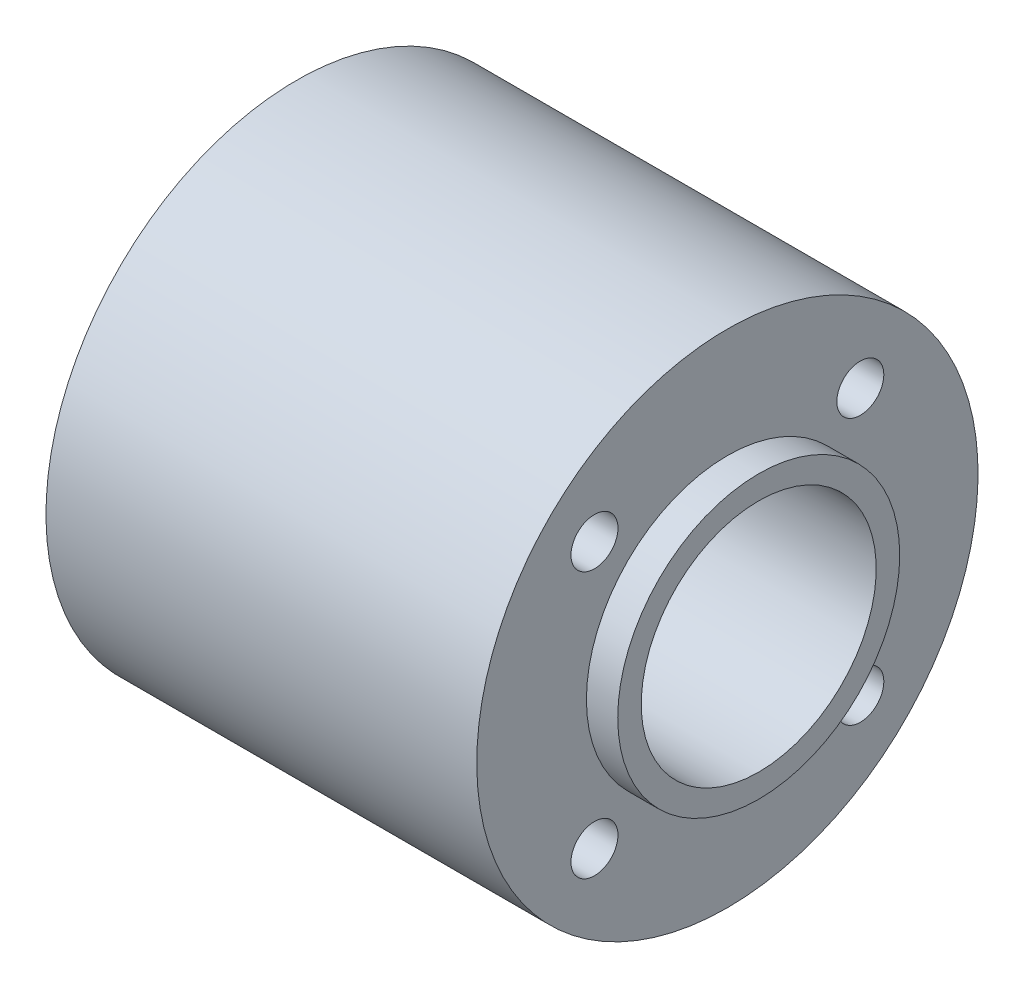
ISO-10303-21;
HEADER;
FILE_DESCRIPTION(('STEP AP214'),'2;1');
FILE_NAME('part.step','',(''),(''),'','','');
FILE_SCHEMA(('AUTOMOTIVE_DESIGN { 1 0 10303 214 1 1 1 1 }'));
ENDSEC;
DATA;
#1=APPLICATION_CONTEXT('core data for automotive mechanical design processes');
#2=APPLICATION_PROTOCOL_DEFINITION('international standard','automotive_design',2000,#1);
#3=PRODUCT_CONTEXT('',#1,'mechanical');
#4=PRODUCT('Part','Part','',(#3));
#5=PRODUCT_RELATED_PRODUCT_CATEGORY('part','',(#4));
#6=PRODUCT_DEFINITION_FORMATION('','',#4);
#7=PRODUCT_DEFINITION_CONTEXT('part definition',#1,'design');
#8=PRODUCT_DEFINITION('design','',#6,#7);
#9=PRODUCT_DEFINITION_SHAPE('','',#8);
#10=(LENGTH_UNIT() NAMED_UNIT(*) SI_UNIT(.MILLI.,.METRE.));
#11=(NAMED_UNIT(*) PLANE_ANGLE_UNIT() SI_UNIT($,.RADIAN.));
#12=(NAMED_UNIT(*) SI_UNIT($,.STERADIAN.) SOLID_ANGLE_UNIT());
#13=UNCERTAINTY_MEASURE_WITH_UNIT(LENGTH_MEASURE(1.E-05),#10,'distance_accuracy_value','');
#14=(GEOMETRIC_REPRESENTATION_CONTEXT(3) GLOBAL_UNCERTAINTY_ASSIGNED_CONTEXT((#13)) GLOBAL_UNIT_ASSIGNED_CONTEXT((#10,
#11,#12)) REPRESENTATION_CONTEXT('',''));
#15=CARTESIAN_POINT('',(0.,0.,0.));
#16=DIRECTION('',(0.,0.,1.));
#17=DIRECTION('',(1.,0.,0.));
#18=AXIS2_PLACEMENT_3D('',#15,#16,#17);
#19=CARTESIAN_POINT('',(15.75,0.,0.));
#20=DIRECTION('',(-1.,0.,0.));
#21=DIRECTION('',(0.,-1.,0.));
#22=AXIS2_PLACEMENT_3D('',#19,#20,#21);
#23=PLANE('',#22);
#24=CARTESIAN_POINT('',(15.75,0.,0.));
#25=DIRECTION('',(-1.,0.,0.));
#26=DIRECTION('',(0.,-1.,0.));
#27=AXIS2_PLACEMENT_3D('',#24,#25,#26);
#28=CIRCLE('',#27,7.5);
#29=CARTESIAN_POINT('',(15.75,-7.5,0.));
#30=VERTEX_POINT('',#29);
#31=EDGE_CURVE('E72',#30,#30,#28,.T.);
#32=ORIENTED_EDGE('',*,*,#31,.T.);
#33=EDGE_LOOP('',(#32));
#34=FACE_BOUND('',#33,.T.);
#35=CARTESIAN_POINT('',(15.75,0.,0.));
#36=DIRECTION('',(-1.,0.,0.));
#37=DIRECTION('',(0.,-1.,0.));
#38=AXIS2_PLACEMENT_3D('',#35,#36,#37);
#39=CIRCLE('',#38,9.);
#40=CARTESIAN_POINT('',(15.75,-9.,0.));
#41=VERTEX_POINT('',#40);
#42=EDGE_CURVE('E10',#41,#41,#39,.T.);
#43=ORIENTED_EDGE('',*,*,#42,.F.);
#44=EDGE_LOOP('',(#43));
#45=FACE_BOUND('',#44,.T.);
#46=ADVANCED_FACE('F30',(#34,#45),#23,.F.);
#47=CARTESIAN_POINT('',(-15.75,0.,0.));
#48=DIRECTION('',(-1.,0.,0.));
#49=DIRECTION('',(0.,-1.,0.));
#50=AXIS2_PLACEMENT_3D('',#47,#48,#49);
#51=CYLINDRICAL_SURFACE('',#50,9.);
#52=CARTESIAN_POINT('',(13.75,0.,0.));
#53=DIRECTION('',(-1.,0.,0.));
#54=DIRECTION('',(0.,-1.,0.));
#55=AXIS2_PLACEMENT_3D('',#52,#53,#54);
#56=CIRCLE('',#55,9.);
#57=CARTESIAN_POINT('',(13.75,-9.,0.));
#58=VERTEX_POINT('',#57);
#59=EDGE_CURVE('E37',#58,#58,#56,.T.);
#60=ORIENTED_EDGE('',*,*,#59,.F.);
#61=EDGE_LOOP('',(#60));
#62=FACE_BOUND('',#61,.T.);
#63=ORIENTED_EDGE('',*,*,#42,.T.);
#64=EDGE_LOOP('',(#63));
#65=FACE_BOUND('',#64,.T.);
#66=ADVANCED_FACE('F91',(#62,#65),#51,.T.);
#67=CARTESIAN_POINT('',(13.75,9.,0.));
#68=DIRECTION('',(-1.,0.,0.));
#69=DIRECTION('',(0.,-1.,0.));
#70=AXIS2_PLACEMENT_3D('',#67,#68,#69);
#71=PLANE('',#70);
#72=CARTESIAN_POINT('',(13.75,-8.48528137423853,8.48528137423853));
#73=DIRECTION('',(-1.,0.,0.));
#74=DIRECTION('',(0.,-1.,0.));
#75=AXIS2_PLACEMENT_3D('',#72,#73,#74);
#76=CIRCLE('',#75,1.50000000000014);
#77=CARTESIAN_POINT('',(13.75,-9.98528137423866,8.48528137423853));
#78=VERTEX_POINT('',#77);
#79=EDGE_CURVE('E66',#78,#78,#76,.T.);
#80=ORIENTED_EDGE('',*,*,#79,.T.);
#81=EDGE_LOOP('',(#80));
#82=FACE_BOUND('',#81,.T.);
#83=CARTESIAN_POINT('',(13.75,-8.48528137423853,-8.48528137423861));
#84=DIRECTION('',(-1.,0.,0.));
#85=DIRECTION('',(0.,-1.,0.));
#86=AXIS2_PLACEMENT_3D('',#83,#84,#85);
#87=CIRCLE('',#86,1.50000000000018);
#88=CARTESIAN_POINT('',(13.75,-9.98528137423871,-8.48528137423861));
#89=VERTEX_POINT('',#88);
#90=EDGE_CURVE('E55',#89,#89,#87,.T.);
#91=ORIENTED_EDGE('',*,*,#90,.T.);
#92=EDGE_LOOP('',(#91));
#93=FACE_BOUND('',#92,.T.);
#94=CARTESIAN_POINT('',(13.75,8.48528137423857,-8.48528137423873));
#95=DIRECTION('',(-1.,0.,0.));
#96=DIRECTION('',(0.,-1.,0.));
#97=AXIS2_PLACEMENT_3D('',#94,#95,#96);
#98=CIRCLE('',#97,1.50000000000005);
#99=CARTESIAN_POINT('',(13.75,6.98528137423852,-8.48528137423873));
#100=VERTEX_POINT('',#99);
#101=EDGE_CURVE('E52',#100,#100,#98,.T.);
#102=ORIENTED_EDGE('',*,*,#101,.T.);
#103=EDGE_LOOP('',(#102));
#104=FACE_BOUND('',#103,.T.);
#105=CARTESIAN_POINT('',(13.75,8.48528137423861,8.48528137423853));
#106=DIRECTION('',(-1.,0.,0.));
#107=DIRECTION('',(0.,-1.,0.));
#108=AXIS2_PLACEMENT_3D('',#105,#106,#107);
#109=CIRCLE('',#108,1.5);
#110=CARTESIAN_POINT('',(13.75,6.98528137423861,8.48528137423853));
#111=VERTEX_POINT('',#110);
#112=EDGE_CURVE('E49',#111,#111,#109,.T.);
#113=ORIENTED_EDGE('',*,*,#112,.T.);
#114=EDGE_LOOP('',(#113));
#115=FACE_BOUND('',#114,.T.);
#116=CARTESIAN_POINT('',(13.75,0.,0.));
#117=DIRECTION('',(-1.,0.,0.));
#118=DIRECTION('',(0.,-1.,0.));
#119=AXIS2_PLACEMENT_3D('',#116,#117,#118);
#120=CIRCLE('',#119,16.);
#121=CARTESIAN_POINT('',(13.75,-16.,0.));
#122=VERTEX_POINT('',#121);
#123=EDGE_CURVE('E42',#122,#122,#120,.T.);
#124=ORIENTED_EDGE('',*,*,#123,.F.);
#125=EDGE_LOOP('',(#124));
#126=FACE_BOUND('',#125,.T.);
#127=ORIENTED_EDGE('',*,*,#59,.T.);
#128=EDGE_LOOP('',(#127));
#129=FACE_BOUND('',#128,.T.);
#130=ADVANCED_FACE('F88',(#82,#93,#104,#115,#126,#129),#71,.F.);
#131=CARTESIAN_POINT('',(-15.75,0.,0.));
#132=DIRECTION('',(-1.,0.,0.));
#133=DIRECTION('',(0.,-1.,0.));
#134=AXIS2_PLACEMENT_3D('',#131,#132,#133);
#135=CYLINDRICAL_SURFACE('',#134,16.);
#136=CARTESIAN_POINT('',(-13.75,0.,0.));
#137=DIRECTION('',(-1.,0.,0.));
#138=DIRECTION('',(0.,-1.,0.));
#139=AXIS2_PLACEMENT_3D('',#136,#137,#138);
#140=CIRCLE('',#139,16.);
#141=CARTESIAN_POINT('',(-13.75,-16.,0.));
#142=VERTEX_POINT('',#141);
#143=EDGE_CURVE('E81',#142,#142,#140,.T.);
#144=ORIENTED_EDGE('',*,*,#143,.F.);
#145=EDGE_LOOP('',(#144));
#146=FACE_BOUND('',#145,.T.);
#147=ORIENTED_EDGE('',*,*,#123,.T.);
#148=EDGE_LOOP('',(#147));
#149=FACE_BOUND('',#148,.T.);
#150=ADVANCED_FACE('F86',(#146,#149),#135,.T.);
#151=CARTESIAN_POINT('',(-13.75,9.,0.));
#152=DIRECTION('',(1.,0.,0.));
#153=DIRECTION('',(0.,1.,0.));
#154=AXIS2_PLACEMENT_3D('',#151,#152,#153);
#155=PLANE('',#154);
#156=CARTESIAN_POINT('',(-13.75,-8.48528137423853,8.48528137423853));
#157=DIRECTION('',(1.,0.,0.));
#158=DIRECTION('',(0.,1.,0.));
#159=AXIS2_PLACEMENT_3D('',#156,#157,#158);
#160=CIRCLE('',#159,1.50000000000014);
#161=CARTESIAN_POINT('',(-13.75,-6.98528137423839,8.48528137423853));
#162=VERTEX_POINT('',#161);
#163=EDGE_CURVE('E33',#162,#162,#160,.T.);
#164=ORIENTED_EDGE('',*,*,#163,.T.);
#165=EDGE_LOOP('',(#164));
#166=FACE_BOUND('',#165,.T.);
#167=CARTESIAN_POINT('',(-13.75,-8.48528137423853,-8.48528137423861));
#168=DIRECTION('',(1.,0.,0.));
#169=DIRECTION('',(0.,1.,0.));
#170=AXIS2_PLACEMENT_3D('',#167,#168,#169);
#171=CIRCLE('',#170,1.50000000000018);
#172=CARTESIAN_POINT('',(-13.75,-6.98528137423835,-8.48528137423861));
#173=VERTEX_POINT('',#172);
#174=EDGE_CURVE('E53',#173,#173,#171,.T.);
#175=ORIENTED_EDGE('',*,*,#174,.T.);
#176=EDGE_LOOP('',(#175));
#177=FACE_BOUND('',#176,.T.);
#178=CARTESIAN_POINT('',(-13.75,8.48528137423857,-8.48528137423873));
#179=DIRECTION('',(1.,0.,0.));
#180=DIRECTION('',(0.,1.,0.));
#181=AXIS2_PLACEMENT_3D('',#178,#179,#180);
#182=CIRCLE('',#181,1.50000000000005);
#183=CARTESIAN_POINT('',(-13.75,9.98528137423862,-8.48528137423873));
#184=VERTEX_POINT('',#183);
#185=EDGE_CURVE('E50',#184,#184,#182,.T.);
#186=ORIENTED_EDGE('',*,*,#185,.T.);
#187=EDGE_LOOP('',(#186));
#188=FACE_BOUND('',#187,.T.);
#189=CARTESIAN_POINT('',(-13.75,8.48528137423861,8.48528137423853));
#190=DIRECTION('',(1.,0.,0.));
#191=DIRECTION('',(0.,1.,0.));
#192=AXIS2_PLACEMENT_3D('',#189,#190,#191);
#193=CIRCLE('',#192,1.5);
#194=CARTESIAN_POINT('',(-13.75,9.98528137423861,8.48528137423853));
#195=VERTEX_POINT('',#194);
#196=EDGE_CURVE('E46',#195,#195,#193,.T.);
#197=ORIENTED_EDGE('',*,*,#196,.T.);
#198=EDGE_LOOP('',(#197));
#199=FACE_BOUND('',#198,.T.);
#200=CARTESIAN_POINT('',(-13.75,0.,0.));
#201=DIRECTION('',(-1.,0.,0.));
#202=DIRECTION('',(0.,-1.,0.));
#203=AXIS2_PLACEMENT_3D('',#200,#201,#202);
#204=CIRCLE('',#203,9.);
#205=CARTESIAN_POINT('',(-13.75,-8.99999999999999,0.));
#206=VERTEX_POINT('',#205);
#207=EDGE_CURVE('E78',#206,#206,#204,.T.);
#208=ORIENTED_EDGE('',*,*,#207,.F.);
#209=EDGE_LOOP('',(#208));
#210=FACE_BOUND('',#209,.T.);
#211=ORIENTED_EDGE('',*,*,#143,.T.);
#212=EDGE_LOOP('',(#211));
#213=FACE_BOUND('',#212,.T.);
#214=ADVANCED_FACE('F104',(#166,#177,#188,#199,#210,#213),#155,.F.);
#215=CARTESIAN_POINT('',(-15.75,0.,0.));
#216=DIRECTION('',(-1.,0.,0.));
#217=DIRECTION('',(0.,-1.,0.));
#218=AXIS2_PLACEMENT_3D('',#215,#216,#217);
#219=CYLINDRICAL_SURFACE('',#218,9.);
#220=CARTESIAN_POINT('',(-15.75,0.,0.));
#221=DIRECTION('',(-1.,0.,0.));
#222=DIRECTION('',(0.,-1.,0.));
#223=AXIS2_PLACEMENT_3D('',#220,#221,#222);
#224=CIRCLE('',#223,9.);
#225=CARTESIAN_POINT('',(-15.75,-8.99999999999999,0.));
#226=VERTEX_POINT('',#225);
#227=EDGE_CURVE('E75',#226,#226,#224,.T.);
#228=ORIENTED_EDGE('',*,*,#227,.F.);
#229=EDGE_LOOP('',(#228));
#230=FACE_BOUND('',#229,.T.);
#231=ORIENTED_EDGE('',*,*,#207,.T.);
#232=EDGE_LOOP('',(#231));
#233=FACE_BOUND('',#232,.T.);
#234=ADVANCED_FACE('F108',(#230,#233),#219,.T.);
#235=CARTESIAN_POINT('',(-15.75,0.,0.));
#236=DIRECTION('',(1.,0.,0.));
#237=DIRECTION('',(0.,1.,0.));
#238=AXIS2_PLACEMENT_3D('',#235,#236,#237);
#239=PLANE('',#238);
#240=CARTESIAN_POINT('',(-15.75,0.,0.));
#241=DIRECTION('',(1.,0.,0.));
#242=DIRECTION('',(0.,1.,0.));
#243=AXIS2_PLACEMENT_3D('',#240,#241,#242);
#244=CIRCLE('',#243,7.5);
#245=CARTESIAN_POINT('',(-15.75,7.5,0.));
#246=VERTEX_POINT('',#245);
#247=EDGE_CURVE('E69',#246,#246,#244,.T.);
#248=ORIENTED_EDGE('',*,*,#247,.T.);
#249=EDGE_LOOP('',(#248));
#250=FACE_BOUND('',#249,.T.);
#251=ORIENTED_EDGE('',*,*,#227,.T.);
#252=EDGE_LOOP('',(#251));
#253=FACE_BOUND('',#252,.T.);
#254=ADVANCED_FACE('F112',(#250,#253),#239,.F.);
#255=CARTESIAN_POINT('',(-15.75,0.,0.));
#256=DIRECTION('',(1.,0.,0.));
#257=DIRECTION('',(0.,1.,0.));
#258=AXIS2_PLACEMENT_3D('',#255,#256,#257);
#259=CYLINDRICAL_SURFACE('',#258,7.5);
#260=ORIENTED_EDGE('',*,*,#247,.F.);
#261=EDGE_LOOP('',(#260));
#262=FACE_BOUND('',#261,.T.);
#263=ORIENTED_EDGE('',*,*,#31,.F.);
#264=EDGE_LOOP('',(#263));
#265=FACE_BOUND('',#264,.T.);
#266=ADVANCED_FACE('F116',(#262,#265),#259,.F.);
#267=CARTESIAN_POINT('',(-15.75,8.48528137423861,8.48528137423853));
#268=DIRECTION('',(1.,0.,0.));
#269=DIRECTION('',(0.,1.,0.));
#270=AXIS2_PLACEMENT_3D('',#267,#268,#269);
#271=CYLINDRICAL_SURFACE('',#270,1.5);
#272=ORIENTED_EDGE('',*,*,#196,.F.);
#273=EDGE_LOOP('',(#272));
#274=FACE_BOUND('',#273,.T.);
#275=ORIENTED_EDGE('',*,*,#112,.F.);
#276=EDGE_LOOP('',(#275));
#277=FACE_BOUND('',#276,.T.);
#278=ADVANCED_FACE('F120',(#274,#277),#271,.F.);
#279=CARTESIAN_POINT('',(-15.75,8.48528137423857,-8.48528137423873));
#280=DIRECTION('',(1.,0.,0.));
#281=DIRECTION('',(0.,1.,0.));
#282=AXIS2_PLACEMENT_3D('',#279,#280,#281);
#283=CYLINDRICAL_SURFACE('',#282,1.50000000000005);
#284=ORIENTED_EDGE('',*,*,#185,.F.);
#285=EDGE_LOOP('',(#284));
#286=FACE_BOUND('',#285,.T.);
#287=ORIENTED_EDGE('',*,*,#101,.F.);
#288=EDGE_LOOP('',(#287));
#289=FACE_BOUND('',#288,.T.);
#290=ADVANCED_FACE('F124',(#286,#289),#283,.F.);
#291=CARTESIAN_POINT('',(-15.75,-8.48528137423853,-8.48528137423861));
#292=DIRECTION('',(1.,0.,0.));
#293=DIRECTION('',(0.,1.,0.));
#294=AXIS2_PLACEMENT_3D('',#291,#292,#293);
#295=CYLINDRICAL_SURFACE('',#294,1.50000000000018);
#296=ORIENTED_EDGE('',*,*,#174,.F.);
#297=EDGE_LOOP('',(#296));
#298=FACE_BOUND('',#297,.T.);
#299=ORIENTED_EDGE('',*,*,#90,.F.);
#300=EDGE_LOOP('',(#299));
#301=FACE_BOUND('',#300,.T.);
#302=ADVANCED_FACE('F129',(#298,#301),#295,.F.);
#303=CARTESIAN_POINT('',(-15.75,-8.48528137423853,8.48528137423853));
#304=DIRECTION('',(1.,0.,0.));
#305=DIRECTION('',(0.,1.,0.));
#306=AXIS2_PLACEMENT_3D('',#303,#304,#305);
#307=CYLINDRICAL_SURFACE('',#306,1.50000000000014);
#308=ORIENTED_EDGE('',*,*,#163,.F.);
#309=EDGE_LOOP('',(#308));
#310=FACE_BOUND('',#309,.T.);
#311=ORIENTED_EDGE('',*,*,#79,.F.);
#312=EDGE_LOOP('',(#311));
#313=FACE_BOUND('',#312,.T.);
#314=ADVANCED_FACE('F126',(#310,#313),#307,.F.);
#315=CLOSED_SHELL('',(#46,#66,#130,#150,#214,#234,#254,#266,#278,#290,#302,#314));
#316=MANIFOLD_SOLID_BREP('B2',#315);
#317=ADVANCED_BREP_SHAPE_REPRESENTATION('',(#18,#316),#14);
#318=SHAPE_DEFINITION_REPRESENTATION(#9,#317);
ENDSEC;
END-ISO-10303-21;
